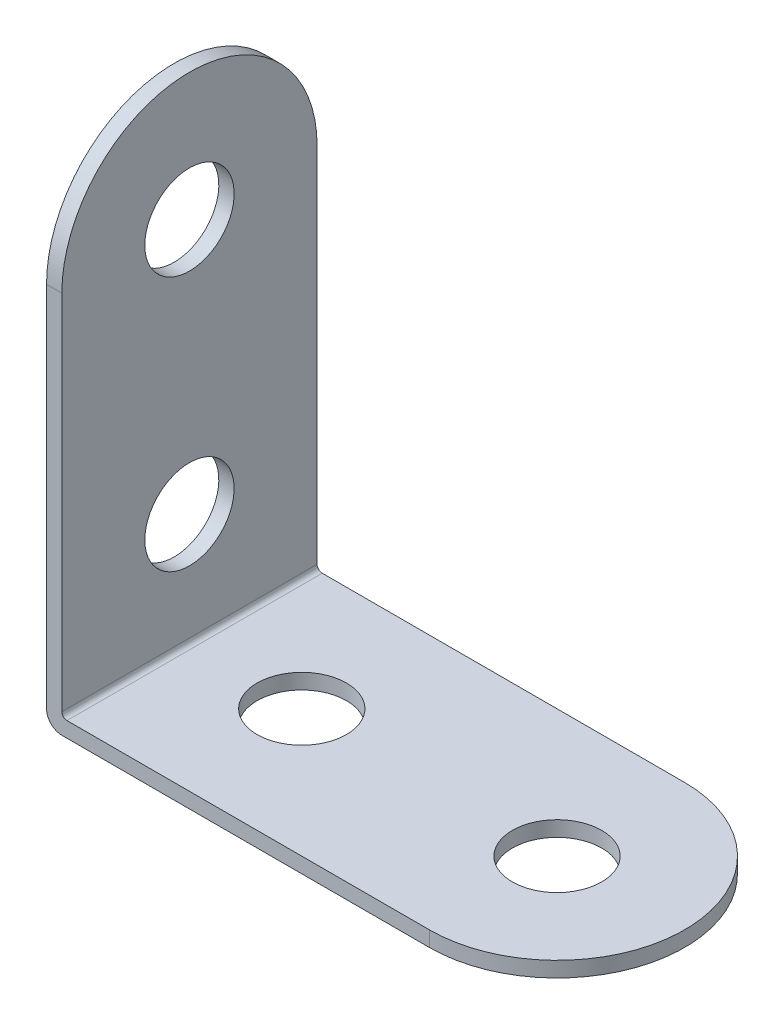
ISO-10303-21;
HEADER;
FILE_DESCRIPTION(('STEP AP214'),'2;1');
FILE_NAME('part.step','',(''),(''),'','','');
FILE_SCHEMA(('AUTOMOTIVE_DESIGN { 1 0 10303 214 1 1 1 1 }'));
ENDSEC;
DATA;
#1=APPLICATION_CONTEXT('core data for automotive mechanical design processes');
#2=APPLICATION_PROTOCOL_DEFINITION('international standard','automotive_design',2000,#1);
#3=PRODUCT_CONTEXT('',#1,'mechanical');
#4=PRODUCT('Part','Part','',(#3));
#5=PRODUCT_RELATED_PRODUCT_CATEGORY('part','',(#4));
#6=PRODUCT_DEFINITION_FORMATION('','',#4);
#7=PRODUCT_DEFINITION_CONTEXT('part definition',#1,'design');
#8=PRODUCT_DEFINITION('design','',#6,#7);
#9=PRODUCT_DEFINITION_SHAPE('','',#8);
#10=(LENGTH_UNIT() NAMED_UNIT(*) SI_UNIT(.MILLI.,.METRE.));
#11=(NAMED_UNIT(*) PLANE_ANGLE_UNIT() SI_UNIT($,.RADIAN.));
#12=(NAMED_UNIT(*) SI_UNIT($,.STERADIAN.) SOLID_ANGLE_UNIT());
#13=UNCERTAINTY_MEASURE_WITH_UNIT(LENGTH_MEASURE(1.E-05),#10,'distance_accuracy_value','');
#14=(GEOMETRIC_REPRESENTATION_CONTEXT(3) GLOBAL_UNCERTAINTY_ASSIGNED_CONTEXT((#13)) GLOBAL_UNIT_ASSIGNED_CONTEXT((#10,
#11,#12)) REPRESENTATION_CONTEXT('',''));
#15=CARTESIAN_POINT('',(0.,0.,0.));
#16=DIRECTION('',(0.,0.,1.));
#17=DIRECTION('',(1.,0.,0.));
#18=AXIS2_PLACEMENT_3D('',#15,#16,#17);
#19=CARTESIAN_POINT('',(19.0500000000001,0.761999999999957,6.35000000000004));
#20=DIRECTION('',(0.,-1.,0.));
#21=DIRECTION('',(0.,0.,-1.));
#22=AXIS2_PLACEMENT_3D('',#19,#20,#21);
#23=CYLINDRICAL_SURFACE('',#22,2.2225);
#24=CARTESIAN_POINT('',(19.0500000000001,0.,6.35000000000004));
#25=DIRECTION('',(0.,1.,0.));
#26=DIRECTION('',(1.,0.,0.));
#27=AXIS2_PLACEMENT_3D('',#24,#25,#26);
#28=CIRCLE('',#27,2.2225);
#29=CARTESIAN_POINT('',(21.2725000000001,0.,6.35000000000004));
#30=VERTEX_POINT('',#29);
#31=EDGE_CURVE('E190',#30,#30,#28,.T.);
#32=ORIENTED_EDGE('',*,*,#31,.F.);
#33=EDGE_LOOP('',(#32));
#34=FACE_BOUND('',#33,.T.);
#35=CARTESIAN_POINT('',(19.0500000000001,0.761999999999957,6.35000000000004));
#36=DIRECTION('',(0.,-1.,0.));
#37=DIRECTION('',(0.,0.,-1.));
#38=AXIS2_PLACEMENT_3D('',#35,#36,#37);
#39=CIRCLE('',#38,2.2225);
#40=CARTESIAN_POINT('',(19.0500000000001,0.761999999999957,4.12750000000004));
#41=VERTEX_POINT('',#40);
#42=EDGE_CURVE('E147',#41,#41,#39,.T.);
#43=ORIENTED_EDGE('',*,*,#42,.F.);
#44=EDGE_LOOP('',(#43));
#45=FACE_BOUND('',#44,.T.);
#46=ADVANCED_FACE('F16',(#34,#45),#23,.F.);
#47=CARTESIAN_POINT('',(19.0500000000001,0.761999999999957,6.35000000000004));
#48=DIRECTION('',(0.,-1.,0.));
#49=DIRECTION('',(0.,0.,-1.));
#50=AXIS2_PLACEMENT_3D('',#47,#48,#49);
#51=CYLINDRICAL_SURFACE('',#50,6.35);
#52=CARTESIAN_POINT('',(19.0500000000001,0.,6.35000000000004));
#53=DIRECTION('',(0.,-1.,0.));
#54=DIRECTION('',(0.,0.,-1.));
#55=AXIS2_PLACEMENT_3D('',#52,#53,#54);
#56=CIRCLE('',#55,6.35);
#57=CARTESIAN_POINT('',(19.05,0.,0.));
#58=VERTEX_POINT('',#57);
#59=CARTESIAN_POINT('',(19.05,0.,12.7));
#60=VERTEX_POINT('',#59);
#61=EDGE_CURVE('E35',#58,#60,#56,.T.);
#62=ORIENTED_EDGE('',*,*,#61,.F.);
#63=DIRECTION('',(0.,1.,0.));
#64=VECTOR('',#63,1.);
#65=CARTESIAN_POINT('',(19.05,0.761999999999957,0.));
#66=LINE('',#65,#64);
#67=CARTESIAN_POINT('',(19.05,0.761999999999957,0.));
#68=VERTEX_POINT('',#67);
#69=EDGE_CURVE('E11',#58,#68,#66,.T.);
#70=ORIENTED_EDGE('',*,*,#69,.T.);
#71=CARTESIAN_POINT('',(19.0500000000001,0.761999999999957,6.35000000000004));
#72=DIRECTION('',(0.,1.,0.));
#73=DIRECTION('',(1.,0.,0.));
#74=AXIS2_PLACEMENT_3D('',#71,#72,#73);
#75=CIRCLE('',#74,6.35);
#76=CARTESIAN_POINT('',(19.05,0.761999999999957,12.7));
#77=VERTEX_POINT('',#76);
#78=EDGE_CURVE('E165',#77,#68,#75,.T.);
#79=ORIENTED_EDGE('',*,*,#78,.F.);
#80=DIRECTION('',(0.,1.,0.));
#81=VECTOR('',#80,1.);
#82=CARTESIAN_POINT('',(19.05,0.761999999999957,12.7));
#83=LINE('',#82,#81);
#84=EDGE_CURVE('E126',#60,#77,#83,.T.);
#85=ORIENTED_EDGE('',*,*,#84,.F.);
#86=EDGE_LOOP('',(#62,#70,#79,#85));
#87=FACE_BOUND('',#86,.T.);
#88=ADVANCED_FACE('F249',(#87),#51,.T.);
#89=CARTESIAN_POINT('',(6.35000000000008,0.761999999999957,6.34999999999997));
#90=DIRECTION('',(0.,-1.,0.));
#91=DIRECTION('',(0.,0.,-1.));
#92=AXIS2_PLACEMENT_3D('',#89,#90,#91);
#93=CYLINDRICAL_SURFACE('',#92,2.2225);
#94=CARTESIAN_POINT('',(6.35000000000008,0.,6.34999999999997));
#95=DIRECTION('',(0.,1.,0.));
#96=DIRECTION('',(1.,0.,0.));
#97=AXIS2_PLACEMENT_3D('',#94,#95,#96);
#98=CIRCLE('',#97,2.2225);
#99=CARTESIAN_POINT('',(8.57250000000008,0.,6.34999999999997));
#100=VERTEX_POINT('',#99);
#101=EDGE_CURVE('E27',#100,#100,#98,.T.);
#102=ORIENTED_EDGE('',*,*,#101,.F.);
#103=EDGE_LOOP('',(#102));
#104=FACE_BOUND('',#103,.T.);
#105=CARTESIAN_POINT('',(6.35000000000008,0.761999999999957,6.34999999999997));
#106=DIRECTION('',(0.,-1.,0.));
#107=DIRECTION('',(0.,0.,-1.));
#108=AXIS2_PLACEMENT_3D('',#105,#106,#107);
#109=CIRCLE('',#108,2.2225);
#110=CARTESIAN_POINT('',(6.35000000000008,0.761999999999957,4.12749999999997));
#111=VERTEX_POINT('',#110);
#112=EDGE_CURVE('E160',#111,#111,#109,.T.);
#113=ORIENTED_EDGE('',*,*,#112,.F.);
#114=EDGE_LOOP('',(#113));
#115=FACE_BOUND('',#114,.T.);
#116=ADVANCED_FACE('F255',(#104,#115),#93,.F.);
#117=CARTESIAN_POINT('',(25.4000000000001,0.,0.));
#118=DIRECTION('',(0.,-1.,0.));
#119=DIRECTION('',(1.,0.,0.));
#120=AXIS2_PLACEMENT_3D('',#117,#118,#119);
#121=PLANE('',#120);
#122=ORIENTED_EDGE('',*,*,#101,.T.);
#123=EDGE_LOOP('',(#122));
#124=FACE_BOUND('',#123,.T.);
#125=ORIENTED_EDGE('',*,*,#31,.T.);
#126=EDGE_LOOP('',(#125));
#127=FACE_BOUND('',#126,.T.);
#128=ORIENTED_EDGE('',*,*,#61,.T.);
#129=DIRECTION('',(-1.,0.,0.));
#130=VECTOR('',#129,1.);
#131=CARTESIAN_POINT('',(0.76200000000004,0.,12.6999999999999));
#132=LINE('',#131,#130);
#133=CARTESIAN_POINT('',(0.76200000000004,0.,12.6999999999999));
#134=VERTEX_POINT('',#133);
#135=EDGE_CURVE('E194',#60,#134,#132,.T.);
#136=ORIENTED_EDGE('',*,*,#135,.T.);
#137=DIRECTION('',(0.,0.,1.));
#138=VECTOR('',#137,1.);
#139=CARTESIAN_POINT('',(0.76200000000004,0.,0.));
#140=LINE('',#139,#138);
#141=CARTESIAN_POINT('',(0.76200000000004,0.,0.));
#142=VERTEX_POINT('',#141);
#143=EDGE_CURVE('E105',#142,#134,#140,.T.);
#144=ORIENTED_EDGE('',*,*,#143,.F.);
#145=DIRECTION('',(1.,0.,0.));
#146=VECTOR('',#145,1.);
#147=CARTESIAN_POINT('',(0.76200000000004,0.,0.));
#148=LINE('',#147,#146);
#149=EDGE_CURVE('E103',#142,#58,#148,.T.);
#150=ORIENTED_EDGE('',*,*,#149,.T.);
#151=EDGE_LOOP('',(#128,#136,#144,#150));
#152=FACE_BOUND('',#151,.T.);
#153=ADVANCED_FACE('F209',(#124,#127,#152),#121,.T.);
#154=CARTESIAN_POINT('',(0.76200000000004,19.05,6.35000000000004));
#155=DIRECTION('',(-1.,0.,0.));
#156=DIRECTION('',(0.,0.,1.));
#157=AXIS2_PLACEMENT_3D('',#154,#155,#156);
#158=CYLINDRICAL_SURFACE('',#157,2.2225);
#159=CARTESIAN_POINT('',(0.,19.05,6.34999999999998));
#160=DIRECTION('',(1.,0.,0.));
#161=DIRECTION('',(0.,1.,0.));
#162=AXIS2_PLACEMENT_3D('',#159,#160,#161);
#163=CIRCLE('',#162,2.2225);
#164=CARTESIAN_POINT('',(0.,21.2725,6.34999999999998));
#165=VERTEX_POINT('',#164);
#166=EDGE_CURVE('E138',#165,#165,#163,.T.);
#167=ORIENTED_EDGE('',*,*,#166,.F.);
#168=EDGE_LOOP('',(#167));
#169=FACE_BOUND('',#168,.T.);
#170=CARTESIAN_POINT('',(0.76200000000004,19.05,6.35000000000004));
#171=DIRECTION('',(-1.,0.,0.));
#172=DIRECTION('',(0.,0.,1.));
#173=AXIS2_PLACEMENT_3D('',#170,#171,#172);
#174=CIRCLE('',#173,2.2225);
#175=CARTESIAN_POINT('',(0.76200000000004,19.05,8.57250000000004));
#176=VERTEX_POINT('',#175);
#177=EDGE_CURVE('E120',#176,#176,#174,.T.);
#178=ORIENTED_EDGE('',*,*,#177,.F.);
#179=EDGE_LOOP('',(#178));
#180=FACE_BOUND('',#179,.T.);
#181=ADVANCED_FACE('F205',(#169,#180),#158,.F.);
#182=CARTESIAN_POINT('',(0.76200000000004,19.05,6.35000000000004));
#183=DIRECTION('',(-1.,0.,0.));
#184=DIRECTION('',(0.,0.,1.));
#185=AXIS2_PLACEMENT_3D('',#182,#183,#184);
#186=CYLINDRICAL_SURFACE('',#185,6.35);
#187=CARTESIAN_POINT('',(0.,19.05,6.34999999999998));
#188=DIRECTION('',(-1.,0.,0.));
#189=DIRECTION('',(0.,0.,1.));
#190=AXIS2_PLACEMENT_3D('',#187,#188,#189);
#191=CIRCLE('',#190,6.35);
#192=CARTESIAN_POINT('',(0.,19.05,12.7));
#193=VERTEX_POINT('',#192);
#194=CARTESIAN_POINT('',(0.,19.05,0.));
#195=VERTEX_POINT('',#194);
#196=EDGE_CURVE('E109',#193,#195,#191,.T.);
#197=ORIENTED_EDGE('',*,*,#196,.F.);
#198=DIRECTION('',(1.,0.,0.));
#199=VECTOR('',#198,1.);
#200=CARTESIAN_POINT('',(0.76200000000004,19.05,12.7));
#201=LINE('',#200,#199);
#202=CARTESIAN_POINT('',(0.76200000000004,19.05,12.7));
#203=VERTEX_POINT('',#202);
#204=EDGE_CURVE('E122',#193,#203,#201,.T.);
#205=ORIENTED_EDGE('',*,*,#204,.T.);
#206=CARTESIAN_POINT('',(0.76200000000004,19.05,6.35000000000004));
#207=DIRECTION('',(1.,0.,0.));
#208=DIRECTION('',(0.,1.,0.));
#209=AXIS2_PLACEMENT_3D('',#206,#207,#208);
#210=CIRCLE('',#209,6.35);
#211=CARTESIAN_POINT('',(0.76200000000004,19.05,0.));
#212=VERTEX_POINT('',#211);
#213=EDGE_CURVE('E127',#212,#203,#210,.T.);
#214=ORIENTED_EDGE('',*,*,#213,.F.);
#215=DIRECTION('',(1.,0.,0.));
#216=VECTOR('',#215,1.);
#217=CARTESIAN_POINT('',(0.76200000000004,19.05,0.));
#218=LINE('',#217,#216);
#219=EDGE_CURVE('E131',#195,#212,#218,.T.);
#220=ORIENTED_EDGE('',*,*,#219,.F.);
#221=EDGE_LOOP('',(#197,#205,#214,#220));
#222=FACE_BOUND('',#221,.T.);
#223=ADVANCED_FACE('F208',(#222),#186,.T.);
#224=CARTESIAN_POINT('',(0.76200000000004,6.34999999999997,6.35000000000004));
#225=DIRECTION('',(-1.,0.,0.));
#226=DIRECTION('',(0.,0.,1.));
#227=AXIS2_PLACEMENT_3D('',#224,#225,#226);
#228=CYLINDRICAL_SURFACE('',#227,2.2225);
#229=CARTESIAN_POINT('',(0.,6.34999999999997,6.34999999999998));
#230=DIRECTION('',(1.,0.,0.));
#231=DIRECTION('',(0.,1.,0.));
#232=AXIS2_PLACEMENT_3D('',#229,#230,#231);
#233=CIRCLE('',#232,2.2225);
#234=CARTESIAN_POINT('',(0.,8.57249999999997,6.34999999999998));
#235=VERTEX_POINT('',#234);
#236=EDGE_CURVE('E134',#235,#235,#233,.T.);
#237=ORIENTED_EDGE('',*,*,#236,.F.);
#238=EDGE_LOOP('',(#237));
#239=FACE_BOUND('',#238,.T.);
#240=CARTESIAN_POINT('',(0.76200000000004,6.34999999999997,6.35000000000004));
#241=DIRECTION('',(-1.,0.,0.));
#242=DIRECTION('',(0.,0.,1.));
#243=AXIS2_PLACEMENT_3D('',#240,#241,#242);
#244=CIRCLE('',#243,2.2225);
#245=CARTESIAN_POINT('',(0.76200000000004,6.34999999999997,8.57250000000004));
#246=VERTEX_POINT('',#245);
#247=EDGE_CURVE('E139',#246,#246,#244,.T.);
#248=ORIENTED_EDGE('',*,*,#247,.F.);
#249=EDGE_LOOP('',(#248));
#250=FACE_BOUND('',#249,.T.);
#251=ADVANCED_FACE('F265',(#239,#250),#228,.F.);
#252=CARTESIAN_POINT('',(6.75404127528734,6.75404127528725,12.7));
#253=DIRECTION('',(0.,0.,1.));
#254=DIRECTION('',(1.,0.,0.));
#255=AXIS2_PLACEMENT_3D('',#252,#253,#254);
#256=PLANE('',#255);
#257=ORIENTED_EDGE('',*,*,#84,.T.);
#258=DIRECTION('',(1.,0.,0.));
#259=VECTOR('',#258,1.);
#260=CARTESIAN_POINT('',(25.4,0.761999999999957,12.7));
#261=LINE('',#260,#259);
#262=CARTESIAN_POINT('',(1.01600000000004,0.761999999999985,12.7));
#263=VERTEX_POINT('',#262);
#264=EDGE_CURVE('E143',#263,#77,#261,.T.);
#265=ORIENTED_EDGE('',*,*,#264,.F.);
#266=CARTESIAN_POINT('',(1.01600000000004,1.01599999999996,12.7));
#267=DIRECTION('',(0.,0.,1.));
#268=DIRECTION('',(1.,0.,0.));
#269=AXIS2_PLACEMENT_3D('',#266,#267,#268);
#270=CIRCLE('',#269,0.254);
#271=CARTESIAN_POINT('',(0.76200000000004,1.01599999999996,12.6999999999999));
#272=VERTEX_POINT('',#271);
#273=EDGE_CURVE('E148',#272,#263,#270,.T.);
#274=ORIENTED_EDGE('',*,*,#273,.F.);
#275=DIRECTION('',(0.,-1.,0.));
#276=VECTOR('',#275,1.);
#277=CARTESIAN_POINT('',(0.76200000000004,1.01599999999996,12.6999999999999));
#278=LINE('',#277,#276);
#279=EDGE_CURVE('E130',#203,#272,#278,.T.);
#280=ORIENTED_EDGE('',*,*,#279,.F.);
#281=ORIENTED_EDGE('',*,*,#204,.F.);
#282=DIRECTION('',(0.,1.,0.));
#283=VECTOR('',#282,1.);
#284=CARTESIAN_POINT('',(0.,25.4,12.7));
#285=LINE('',#284,#283);
#286=CARTESIAN_POINT('',(0.,0.761999999999985,12.7000000000001));
#287=VERTEX_POINT('',#286);
#288=EDGE_CURVE('E96',#287,#193,#285,.T.);
#289=ORIENTED_EDGE('',*,*,#288,.F.);
#290=CARTESIAN_POINT('',(0.76200000000004,0.761999999999985,12.6999999999999));
#291=DIRECTION('',(0.,0.,-1.));
#292=DIRECTION('',(0.,-1.,0.));
#293=AXIS2_PLACEMENT_3D('',#290,#291,#292);
#294=CIRCLE('',#293,0.762000000000001);
#295=EDGE_CURVE('E91',#134,#287,#294,.T.);
#296=ORIENTED_EDGE('',*,*,#295,.F.);
#297=ORIENTED_EDGE('',*,*,#135,.F.);
#298=EDGE_LOOP('',(#257,#265,#274,#280,#281,#289,#296,#297));
#299=FACE_BOUND('',#298,.T.);
#300=ADVANCED_FACE('F268',(#299),#256,.T.);
#301=CARTESIAN_POINT('',(0.76200000000004,25.4,0.));
#302=DIRECTION('',(1.,0.,0.));
#303=DIRECTION('',(0.,0.,-1.));
#304=AXIS2_PLACEMENT_3D('',#301,#302,#303);
#305=PLANE('',#304);
#306=ORIENTED_EDGE('',*,*,#247,.T.);
#307=EDGE_LOOP('',(#306));
#308=FACE_BOUND('',#307,.T.);
#309=ORIENTED_EDGE('',*,*,#177,.T.);
#310=EDGE_LOOP('',(#309));
#311=FACE_BOUND('',#310,.T.);
#312=ORIENTED_EDGE('',*,*,#213,.T.);
#313=ORIENTED_EDGE('',*,*,#279,.T.);
#314=DIRECTION('',(0.,0.,1.));
#315=VECTOR('',#314,1.);
#316=CARTESIAN_POINT('',(0.76200000000004,1.01599999999999,0.));
#317=LINE('',#316,#315);
#318=CARTESIAN_POINT('',(0.76200000000004,1.01599999999999,0.));
#319=VERTEX_POINT('',#318);
#320=EDGE_CURVE('E161',#319,#272,#317,.T.);
#321=ORIENTED_EDGE('',*,*,#320,.F.);
#322=DIRECTION('',(0.,1.,0.));
#323=VECTOR('',#322,1.);
#324=CARTESIAN_POINT('',(0.76200000000004,1.01599999999999,0.));
#325=LINE('',#324,#323);
#326=EDGE_CURVE('E151',#319,#212,#325,.T.);
#327=ORIENTED_EDGE('',*,*,#326,.T.);
#328=EDGE_LOOP('',(#312,#313,#321,#327));
#329=FACE_BOUND('',#328,.T.);
#330=ADVANCED_FACE('F272',(#308,#311,#329),#305,.T.);
#331=CARTESIAN_POINT('',(1.01600000000002,1.01600000000002,0.));
#332=DIRECTION('',(0.,0.,1.));
#333=DIRECTION('',(1.,0.,0.));
#334=AXIS2_PLACEMENT_3D('',#331,#332,#333);
#335=CYLINDRICAL_SURFACE('',#334,0.254);
#336=ORIENTED_EDGE('',*,*,#273,.T.);
#337=DIRECTION('',(0.,0.,1.));
#338=VECTOR('',#337,1.);
#339=CARTESIAN_POINT('',(1.01600000000002,0.762000000000013,0.));
#340=LINE('',#339,#338);
#341=CARTESIAN_POINT('',(1.01600000000002,0.762000000000013,0.));
#342=VERTEX_POINT('',#341);
#343=EDGE_CURVE('E80',#342,#263,#340,.T.);
#344=ORIENTED_EDGE('',*,*,#343,.F.);
#345=CARTESIAN_POINT('',(1.01600000000002,1.01600000000002,0.));
#346=DIRECTION('',(0.,0.,-1.));
#347=DIRECTION('',(0.,-1.,0.));
#348=AXIS2_PLACEMENT_3D('',#345,#346,#347);
#349=CIRCLE('',#348,0.254);
#350=EDGE_CURVE('E152',#342,#319,#349,.T.);
#351=ORIENTED_EDGE('',*,*,#350,.T.);
#352=ORIENTED_EDGE('',*,*,#320,.T.);
#353=EDGE_LOOP('',(#336,#344,#351,#352));
#354=FACE_BOUND('',#353,.T.);
#355=ADVANCED_FACE('F270',(#354),#335,.F.);
#356=CARTESIAN_POINT('',(1.01600000000002,0.762000000000013,0.));
#357=DIRECTION('',(0.,1.,0.));
#358=DIRECTION('',(-1.,0.,0.));
#359=AXIS2_PLACEMENT_3D('',#356,#357,#358);
#360=PLANE('',#359);
#361=ORIENTED_EDGE('',*,*,#78,.T.);
#362=DIRECTION('',(-1.,0.,0.));
#363=VECTOR('',#362,1.);
#364=CARTESIAN_POINT('',(25.4000000000001,0.761999999999957,0.));
#365=LINE('',#364,#363);
#366=EDGE_CURVE('E171',#68,#342,#365,.T.);
#367=ORIENTED_EDGE('',*,*,#366,.T.);
#368=ORIENTED_EDGE('',*,*,#343,.T.);
#369=ORIENTED_EDGE('',*,*,#264,.T.);
#370=EDGE_LOOP('',(#361,#367,#368,#369));
#371=FACE_BOUND('',#370,.T.);
#372=ORIENTED_EDGE('',*,*,#42,.T.);
#373=EDGE_LOOP('',(#372));
#374=FACE_BOUND('',#373,.T.);
#375=ORIENTED_EDGE('',*,*,#112,.T.);
#376=EDGE_LOOP('',(#375));
#377=FACE_BOUND('',#376,.T.);
#378=ADVANCED_FACE('F245',(#371,#374,#377),#360,.T.);
#379=CARTESIAN_POINT('',(0.76200000000004,0.762000000000013,0.));
#380=DIRECTION('',(0.,0.,1.));
#381=DIRECTION('',(1.,0.,0.));
#382=AXIS2_PLACEMENT_3D('',#379,#380,#381);
#383=CYLINDRICAL_SURFACE('',#382,0.762000000000001);
#384=ORIENTED_EDGE('',*,*,#295,.T.);
#385=DIRECTION('',(0.,0.,1.));
#386=VECTOR('',#385,1.);
#387=CARTESIAN_POINT('',(0.,0.762000000000013,0.));
#388=LINE('',#387,#386);
#389=CARTESIAN_POINT('',(0.,0.762000000000013,0.));
#390=VERTEX_POINT('',#389);
#391=EDGE_CURVE('E87',#390,#287,#388,.T.);
#392=ORIENTED_EDGE('',*,*,#391,.F.);
#393=CARTESIAN_POINT('',(0.76200000000004,0.762000000000013,0.));
#394=DIRECTION('',(0.,0.,1.));
#395=DIRECTION('',(1.,0.,0.));
#396=AXIS2_PLACEMENT_3D('',#393,#394,#395);
#397=CIRCLE('',#396,0.762000000000001);
#398=EDGE_CURVE('E89',#390,#142,#397,.T.);
#399=ORIENTED_EDGE('',*,*,#398,.T.);
#400=ORIENTED_EDGE('',*,*,#143,.T.);
#401=EDGE_LOOP('',(#384,#392,#399,#400));
#402=FACE_BOUND('',#401,.T.);
#403=ADVANCED_FACE('F18',(#402),#383,.T.);
#404=CARTESIAN_POINT('',(0.,0.762000000000013,0.));
#405=DIRECTION('',(-1.,0.,0.));
#406=DIRECTION('',(0.,0.,1.));
#407=AXIS2_PLACEMENT_3D('',#404,#405,#406);
#408=PLANE('',#407);
#409=ORIENTED_EDGE('',*,*,#196,.T.);
#410=DIRECTION('',(0.,-1.,0.));
#411=VECTOR('',#410,1.);
#412=CARTESIAN_POINT('',(0.,25.4,0.));
#413=LINE('',#412,#411);
#414=EDGE_CURVE('E20',#195,#390,#413,.T.);
#415=ORIENTED_EDGE('',*,*,#414,.T.);
#416=ORIENTED_EDGE('',*,*,#391,.T.);
#417=ORIENTED_EDGE('',*,*,#288,.T.);
#418=EDGE_LOOP('',(#409,#415,#416,#417));
#419=FACE_BOUND('',#418,.T.);
#420=ORIENTED_EDGE('',*,*,#166,.T.);
#421=EDGE_LOOP('',(#420));
#422=FACE_BOUND('',#421,.T.);
#423=ORIENTED_EDGE('',*,*,#236,.T.);
#424=EDGE_LOOP('',(#423));
#425=FACE_BOUND('',#424,.T.);
#426=ADVANCED_FACE('F107',(#419,#422,#425),#408,.T.);
#427=CARTESIAN_POINT('',(6.75404127528736,6.75404127528723,0.));
#428=DIRECTION('',(0.,0.,1.));
#429=DIRECTION('',(1.,0.,0.));
#430=AXIS2_PLACEMENT_3D('',#427,#428,#429);
#431=PLANE('',#430);
#432=ORIENTED_EDGE('',*,*,#69,.F.);
#433=ORIENTED_EDGE('',*,*,#149,.F.);
#434=ORIENTED_EDGE('',*,*,#398,.F.);
#435=ORIENTED_EDGE('',*,*,#414,.F.);
#436=ORIENTED_EDGE('',*,*,#219,.T.);
#437=ORIENTED_EDGE('',*,*,#326,.F.);
#438=ORIENTED_EDGE('',*,*,#350,.F.);
#439=ORIENTED_EDGE('',*,*,#366,.F.);
#440=EDGE_LOOP('',(#432,#433,#434,#435,#436,#437,#438,#439));
#441=FACE_BOUND('',#440,.T.);
#442=ADVANCED_FACE('F101',(#441),#431,.F.);
#443=CLOSED_SHELL('',(#46,#88,#116,#153,#181,#223,#251,#300,#330,#355,#378,#403,#426,#442));
#444=MANIFOLD_SOLID_BREP('B1',#443);
#445=ADVANCED_BREP_SHAPE_REPRESENTATION('',(#18,#444),#14);
#446=SHAPE_DEFINITION_REPRESENTATION(#9,#445);
ENDSEC;
END-ISO-10303-21;
